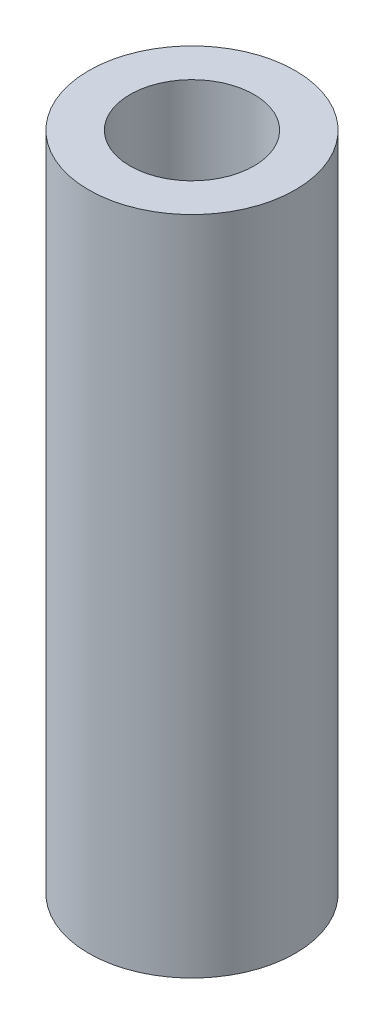
ISO-10303-21;
HEADER;
FILE_DESCRIPTION(('STEP AP214'),'2;1');
FILE_NAME('part.step','',(''),(''),'','','');
FILE_SCHEMA(('AUTOMOTIVE_DESIGN { 1 0 10303 214 1 1 1 1 }'));
ENDSEC;
DATA;
#1=APPLICATION_CONTEXT('core data for automotive mechanical design processes');
#2=APPLICATION_PROTOCOL_DEFINITION('international standard','automotive_design',2000,#1);
#3=PRODUCT_CONTEXT('',#1,'mechanical');
#4=PRODUCT('Part','Part','',(#3));
#5=PRODUCT_RELATED_PRODUCT_CATEGORY('part','',(#4));
#6=PRODUCT_DEFINITION_FORMATION('','',#4);
#7=PRODUCT_DEFINITION_CONTEXT('part definition',#1,'design');
#8=PRODUCT_DEFINITION('design','',#6,#7);
#9=PRODUCT_DEFINITION_SHAPE('','',#8);
#10=(LENGTH_UNIT() NAMED_UNIT(*) SI_UNIT(.MILLI.,.METRE.));
#11=(NAMED_UNIT(*) PLANE_ANGLE_UNIT() SI_UNIT($,.RADIAN.));
#12=(NAMED_UNIT(*) SI_UNIT($,.STERADIAN.) SOLID_ANGLE_UNIT());
#13=UNCERTAINTY_MEASURE_WITH_UNIT(LENGTH_MEASURE(1.E-05),#10,'distance_accuracy_value','');
#14=(GEOMETRIC_REPRESENTATION_CONTEXT(3) GLOBAL_UNCERTAINTY_ASSIGNED_CONTEXT((#13)) GLOBAL_UNIT_ASSIGNED_CONTEXT((#10,
#11,#12)) REPRESENTATION_CONTEXT('',''));
#15=CARTESIAN_POINT('',(0.,0.,0.));
#16=DIRECTION('',(0.,0.,1.));
#17=DIRECTION('',(1.,0.,0.));
#18=AXIS2_PLACEMENT_3D('',#15,#16,#17);
#19=CARTESIAN_POINT('',(0.,16.,0.));
#20=DIRECTION('',(0.,1.,0.));
#21=DIRECTION('',(0.,0.,1.));
#22=AXIS2_PLACEMENT_3D('',#19,#20,#21);
#23=PLANE('',#22);
#24=CARTESIAN_POINT('',(0.,16.,0.));
#25=DIRECTION('',(0.,1.,0.));
#26=DIRECTION('',(0.,0.,1.));
#27=AXIS2_PLACEMENT_3D('',#24,#25,#26);
#28=CIRCLE('',#27,2.5);
#29=CARTESIAN_POINT('',(0.,16.,2.5));
#30=VERTEX_POINT('',#29);
#31=EDGE_CURVE('E10',#30,#30,#28,.T.);
#32=ORIENTED_EDGE('',*,*,#31,.T.);
#33=EDGE_LOOP('',(#32));
#34=FACE_BOUND('',#33,.T.);
#35=CARTESIAN_POINT('',(0.,16.,0.));
#36=DIRECTION('',(0.,1.,0.));
#37=DIRECTION('',(0.,0.,1.));
#38=AXIS2_PLACEMENT_3D('',#35,#36,#37);
#39=CIRCLE('',#38,1.5);
#40=CARTESIAN_POINT('',(0.,16.,1.5));
#41=VERTEX_POINT('',#40);
#42=EDGE_CURVE('E44',#41,#41,#39,.T.);
#43=ORIENTED_EDGE('',*,*,#42,.F.);
#44=EDGE_LOOP('',(#43));
#45=FACE_BOUND('',#44,.T.);
#46=ADVANCED_FACE('F33',(#34,#45),#23,.T.);
#47=CARTESIAN_POINT('',(0.,0.,0.));
#48=DIRECTION('',(0.,1.,0.));
#49=DIRECTION('',(0.,0.,1.));
#50=AXIS2_PLACEMENT_3D('',#47,#48,#49);
#51=PLANE('',#50);
#52=CARTESIAN_POINT('',(0.,0.,0.));
#53=DIRECTION('',(0.,1.,0.));
#54=DIRECTION('',(0.,0.,1.));
#55=AXIS2_PLACEMENT_3D('',#52,#53,#54);
#56=CIRCLE('',#55,2.5);
#57=CARTESIAN_POINT('',(0.,0.,2.5));
#58=VERTEX_POINT('',#57);
#59=EDGE_CURVE('E37',#58,#58,#56,.T.);
#60=ORIENTED_EDGE('',*,*,#59,.F.);
#61=EDGE_LOOP('',(#60));
#62=FACE_BOUND('',#61,.T.);
#63=CARTESIAN_POINT('',(0.,0.,0.));
#64=DIRECTION('',(0.,1.,0.));
#65=DIRECTION('',(0.,0.,1.));
#66=AXIS2_PLACEMENT_3D('',#63,#64,#65);
#67=CIRCLE('',#66,1.5);
#68=CARTESIAN_POINT('',(0.,0.,1.5));
#69=VERTEX_POINT('',#68);
#70=EDGE_CURVE('E46',#69,#69,#67,.T.);
#71=ORIENTED_EDGE('',*,*,#70,.T.);
#72=EDGE_LOOP('',(#71));
#73=FACE_BOUND('',#72,.T.);
#74=ADVANCED_FACE('F56',(#62,#73),#51,.F.);
#75=CARTESIAN_POINT('',(0.,16.,0.));
#76=DIRECTION('',(0.,-1.,0.));
#77=DIRECTION('',(0.,0.,-1.));
#78=AXIS2_PLACEMENT_3D('',#75,#76,#77);
#79=CYLINDRICAL_SURFACE('',#78,2.5);
#80=ORIENTED_EDGE('',*,*,#31,.F.);
#81=EDGE_LOOP('',(#80));
#82=FACE_BOUND('',#81,.T.);
#83=ORIENTED_EDGE('',*,*,#59,.T.);
#84=EDGE_LOOP('',(#83));
#85=FACE_BOUND('',#84,.T.);
#86=ADVANCED_FACE('F35',(#82,#85),#79,.T.);
#87=CARTESIAN_POINT('',(0.,16.,0.));
#88=DIRECTION('',(0.,-1.,0.));
#89=DIRECTION('',(0.,0.,-1.));
#90=AXIS2_PLACEMENT_3D('',#87,#88,#89);
#91=CYLINDRICAL_SURFACE('',#90,1.5);
#92=ORIENTED_EDGE('',*,*,#42,.T.);
#93=EDGE_LOOP('',(#92));
#94=FACE_BOUND('',#93,.T.);
#95=ORIENTED_EDGE('',*,*,#70,.F.);
#96=EDGE_LOOP('',(#95));
#97=FACE_BOUND('',#96,.T.);
#98=ADVANCED_FACE('F52',(#94,#97),#91,.F.);
#99=CLOSED_SHELL('',(#46,#74,#86,#98));
#100=MANIFOLD_SOLID_BREP('B2',#99);
#101=ADVANCED_BREP_SHAPE_REPRESENTATION('',(#18,#100),#14);
#102=SHAPE_DEFINITION_REPRESENTATION(#9,#101);
ENDSEC;
END-ISO-10303-21;
